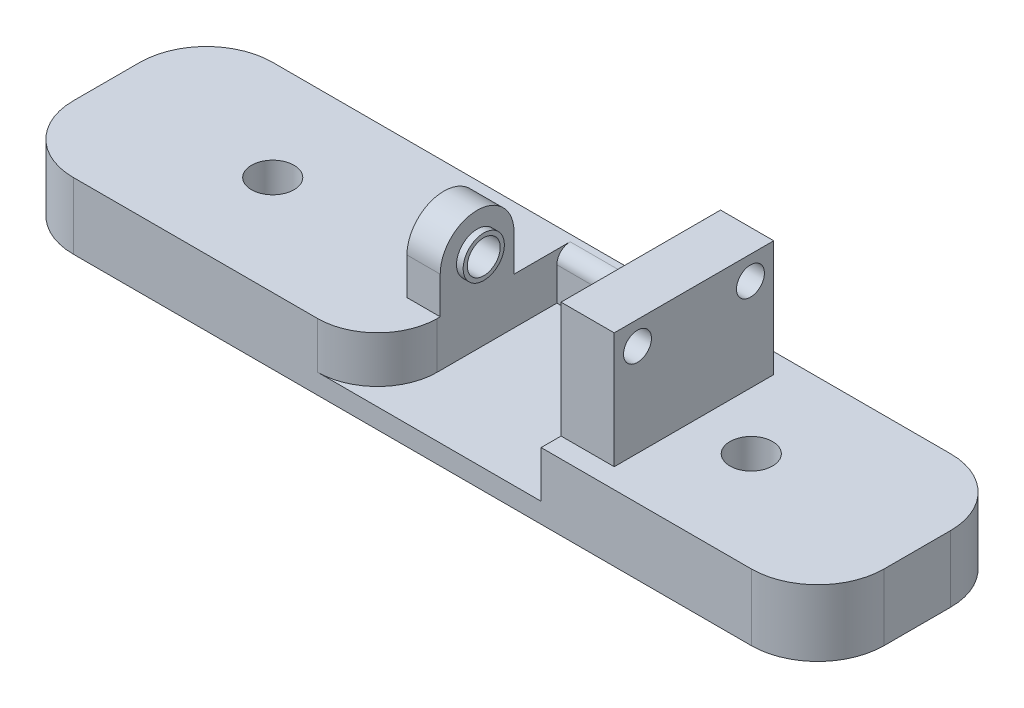
ISO-10303-21;
HEADER;
FILE_DESCRIPTION(('STEP AP214'),'2;1');
FILE_NAME('part.step','',(''),(''),'','','');
FILE_SCHEMA(('AUTOMOTIVE_DESIGN { 1 0 10303 214 1 1 1 1 }'));
ENDSEC;
DATA;
#1=APPLICATION_CONTEXT('core data for automotive mechanical design processes');
#2=APPLICATION_PROTOCOL_DEFINITION('international standard','automotive_design',2000,#1);
#3=PRODUCT_CONTEXT('',#1,'mechanical');
#4=PRODUCT('Part','Part','',(#3));
#5=PRODUCT_RELATED_PRODUCT_CATEGORY('part','',(#4));
#6=PRODUCT_DEFINITION_FORMATION('','',#4);
#7=PRODUCT_DEFINITION_CONTEXT('part definition',#1,'design');
#8=PRODUCT_DEFINITION('design','',#6,#7);
#9=PRODUCT_DEFINITION_SHAPE('','',#8);
#10=(LENGTH_UNIT() NAMED_UNIT(*) SI_UNIT(.MILLI.,.METRE.));
#11=(NAMED_UNIT(*) PLANE_ANGLE_UNIT() SI_UNIT($,.RADIAN.));
#12=(NAMED_UNIT(*) SI_UNIT($,.STERADIAN.) SOLID_ANGLE_UNIT());
#13=UNCERTAINTY_MEASURE_WITH_UNIT(LENGTH_MEASURE(1.E-05),#10,'distance_accuracy_value','');
#14=(GEOMETRIC_REPRESENTATION_CONTEXT(3) GLOBAL_UNCERTAINTY_ASSIGNED_CONTEXT((#13)) GLOBAL_UNIT_ASSIGNED_CONTEXT((#10,
#11,#12)) REPRESENTATION_CONTEXT('',''));
#15=CARTESIAN_POINT('',(0.,0.,0.));
#16=DIRECTION('',(0.,0.,1.));
#17=DIRECTION('',(1.,0.,0.));
#18=AXIS2_PLACEMENT_3D('',#15,#16,#17);
#19=CARTESIAN_POINT('',(-5.25,15.552198,0.));
#20=DIRECTION('',(1.,0.,0.));
#21=DIRECTION('',(0.,0.,-1.));
#22=AXIS2_PLACEMENT_3D('',#19,#20,#21);
#23=PLANE('',#22);
#24=DIRECTION('',(0.,0.,1.));
#25=VECTOR('',#24,1.);
#26=CARTESIAN_POINT('',(-5.25,10.,-12.));
#27=LINE('',#26,#25);
#28=CARTESIAN_POINT('',(-5.25,10.,5.552198));
#29=VERTEX_POINT('',#28);
#30=CARTESIAN_POINT('',(-5.25,10.,5.99999999999999));
#31=VERTEX_POINT('',#30);
#32=EDGE_CURVE('E388',#29,#31,#27,.T.);
#33=ORIENTED_EDGE('',*,*,#32,.T.);
#34=DIRECTION('',(0.,1.,0.));
#35=VECTOR('',#34,1.);
#36=CARTESIAN_POINT('',(-5.25,3.,5.99999999999999));
#37=LINE('',#36,#35);
#38=CARTESIAN_POINT('',(-5.25,3.,5.99999999999999));
#39=VERTEX_POINT('',#38);
#40=EDGE_CURVE('E351',#31,#39,#37,.F.);
#41=ORIENTED_EDGE('',*,*,#40,.T.);
#42=DIRECTION('',(0.,0.,1.));
#43=VECTOR('',#42,1.);
#44=CARTESIAN_POINT('',(-5.25,3.,-12.));
#45=LINE('',#44,#43);
#46=CARTESIAN_POINT('',(-5.25,3.,-12.));
#47=VERTEX_POINT('',#46);
#48=EDGE_CURVE('E214',#47,#39,#45,.T.);
#49=ORIENTED_EDGE('',*,*,#48,.F.);
#50=DIRECTION('',(0.,1.,0.));
#51=VECTOR('',#50,1.);
#52=CARTESIAN_POINT('',(-5.25,3.,-12.));
#53=LINE('',#52,#51);
#54=CARTESIAN_POINT('',(-5.25,8.,-12.));
#55=VERTEX_POINT('',#54);
#56=EDGE_CURVE('E221',#47,#55,#53,.T.);
#57=ORIENTED_EDGE('',*,*,#56,.T.);
#58=CARTESIAN_POINT('',(-5.25,8.,-14.));
#59=DIRECTION('',(1.,0.,0.));
#60=DIRECTION('',(0.,0.,-1.));
#61=AXIS2_PLACEMENT_3D('',#58,#59,#60);
#62=CIRCLE('',#61,2.);
#63=CARTESIAN_POINT('',(-5.25,10.,-14.));
#64=VERTEX_POINT('',#63);
#65=EDGE_CURVE('E53',#55,#64,#62,.F.);
#66=ORIENTED_EDGE('',*,*,#65,.T.);
#67=CARTESIAN_POINT('',(-5.25,10.,-5.552198));
#68=VERTEX_POINT('',#67);
#69=EDGE_CURVE('E60',#64,#68,#27,.T.);
#70=ORIENTED_EDGE('',*,*,#69,.T.);
#71=DIRECTION('',(0.,1.,0.));
#72=VECTOR('',#71,1.);
#73=CARTESIAN_POINT('',(-5.25,10.,-5.552198));
#74=LINE('',#73,#72);
#75=CARTESIAN_POINT('',(-5.25,15.552198,-5.552198));
#76=VERTEX_POINT('',#75);
#77=EDGE_CURVE('E234',#68,#76,#74,.T.);
#78=ORIENTED_EDGE('',*,*,#77,.T.);
#79=CARTESIAN_POINT('',(-5.25,15.552198,0.));
#80=DIRECTION('',(1.,0.,0.));
#81=DIRECTION('',(0.,0.,-1.));
#82=AXIS2_PLACEMENT_3D('',#79,#80,#81);
#83=CIRCLE('',#82,5.552198);
#84=CARTESIAN_POINT('',(-5.25,15.552198,5.552198));
#85=VERTEX_POINT('',#84);
#86=EDGE_CURVE('E229',#76,#85,#83,.T.);
#87=ORIENTED_EDGE('',*,*,#86,.T.);
#88=DIRECTION('',(0.,-1.,0.));
#89=VECTOR('',#88,1.);
#90=CARTESIAN_POINT('',(-5.25,15.552198,5.552198));
#91=LINE('',#90,#89);
#92=EDGE_CURVE('E245',#85,#29,#91,.T.);
#93=ORIENTED_EDGE('',*,*,#92,.T.);
#94=EDGE_LOOP('',(#33,#41,#49,#57,#66,#70,#78,#87,#93));
#95=FACE_BOUND('',#94,.T.);
#96=CARTESIAN_POINT('',(-5.25,15.552198,0.));
#97=DIRECTION('',(1.,0.,0.));
#98=DIRECTION('',(0.,0.,-1.));
#99=AXIS2_PLACEMENT_3D('',#96,#97,#98);
#100=CIRCLE('',#99,3.1);
#101=CARTESIAN_POINT('',(-5.25,15.552198,-3.1));
#102=VERTEX_POINT('',#101);
#103=EDGE_CURVE('E404',#102,#102,#100,.T.);
#104=ORIENTED_EDGE('',*,*,#103,.F.);
#105=EDGE_LOOP('',(#104));
#106=FACE_BOUND('',#105,.T.);
#107=ADVANCED_FACE('F45',(#95,#106),#23,.T.);
#108=CARTESIAN_POINT('',(0.,10.,0.));
#109=DIRECTION('',(0.,1.,0.));
#110=DIRECTION('',(0.,0.,1.));
#111=AXIS2_PLACEMENT_3D('',#108,#109,#110);
#112=PLANE('',#111);
#113=CARTESIAN_POINT('',(-36.,10.,0.));
#114=DIRECTION('',(0.,1.,0.));
#115=DIRECTION('',(0.,0.,1.));
#116=AXIS2_PLACEMENT_3D('',#113,#114,#115);
#117=CIRCLE('',#116,3.2);
#118=CARTESIAN_POINT('',(-36.,10.,3.2));
#119=VERTEX_POINT('',#118);
#120=EDGE_CURVE('E398',#119,#119,#117,.T.);
#121=ORIENTED_EDGE('',*,*,#120,.F.);
#122=EDGE_LOOP('',(#121));
#123=FACE_BOUND('',#122,.T.);
#124=CARTESIAN_POINT('',(36.,10.,0.));
#125=DIRECTION('',(0.,1.,0.));
#126=DIRECTION('',(0.,0.,-1.));
#127=AXIS2_PLACEMENT_3D('',#124,#125,#126);
#128=CIRCLE('',#127,3.2);
#129=CARTESIAN_POINT('',(36.,10.,-3.2));
#130=VERTEX_POINT('',#129);
#131=EDGE_CURVE('E394',#130,#130,#128,.T.);
#132=ORIENTED_EDGE('',*,*,#131,.F.);
#133=EDGE_LOOP('',(#132));
#134=FACE_BOUND('',#133,.T.);
#135=ORIENTED_EDGE('',*,*,#69,.F.);
#136=DIRECTION('',(-1.,0.,0.));
#137=VECTOR('',#136,1.);
#138=CARTESIAN_POINT('',(19.38,10.,-14.));
#139=LINE('',#138,#137);
#140=CARTESIAN_POINT('',(19.38,10.,-14.));
#141=VERTEX_POINT('',#140);
#142=EDGE_CURVE('E358',#64,#141,#139,.F.);
#143=ORIENTED_EDGE('',*,*,#142,.T.);
#144=DIRECTION('',(0.,0.,1.));
#145=VECTOR('',#144,1.);
#146=CARTESIAN_POINT('',(19.38,10.,0.));
#147=LINE('',#146,#145);
#148=CARTESIAN_POINT('',(19.38,10.,-12.));
#149=VERTEX_POINT('',#148);
#150=EDGE_CURVE('E67',#141,#149,#147,.T.);
#151=ORIENTED_EDGE('',*,*,#150,.T.);
#152=DIRECTION('',(-1.,0.,0.));
#153=VECTOR('',#152,1.);
#154=CARTESIAN_POINT('',(27.38,10.,-12.));
#155=LINE('',#154,#153);
#156=CARTESIAN_POINT('',(27.38,10.,-12.));
#157=VERTEX_POINT('',#156);
#158=EDGE_CURVE('E281',#157,#149,#155,.T.);
#159=ORIENTED_EDGE('',*,*,#158,.F.);
#160=DIRECTION('',(0.,0.,-1.));
#161=VECTOR('',#160,1.);
#162=CARTESIAN_POINT('',(27.38,10.,12.));
#163=LINE('',#162,#161);
#164=CARTESIAN_POINT('',(27.38,10.,12.));
#165=VERTEX_POINT('',#164);
#166=EDGE_CURVE('E262',#165,#157,#163,.T.);
#167=ORIENTED_EDGE('',*,*,#166,.F.);
#168=DIRECTION('',(-1.,0.,0.));
#169=VECTOR('',#168,1.);
#170=CARTESIAN_POINT('',(27.38,10.,12.));
#171=LINE('',#170,#169);
#172=CARTESIAN_POINT('',(19.38,10.,12.));
#173=VERTEX_POINT('',#172);
#174=EDGE_CURVE('E284',#165,#173,#171,.T.);
#175=ORIENTED_EDGE('',*,*,#174,.T.);
#176=DIRECTION('',(0.,0.,-1.));
#177=VECTOR('',#176,1.);
#178=CARTESIAN_POINT('',(19.38,10.,-12.));
#179=LINE('',#178,#177);
#180=CARTESIAN_POINT('',(19.38,10.,15.));
#181=VERTEX_POINT('',#180);
#182=EDGE_CURVE('E384',#181,#173,#179,.T.);
#183=ORIENTED_EDGE('',*,*,#182,.F.);
#184=DIRECTION('',(1.,0.,0.));
#185=VECTOR('',#184,1.);
#186=CARTESIAN_POINT('',(-61.,10.,15.));
#187=LINE('',#186,#185);
#188=CARTESIAN_POINT('',(51.,10.,15.));
#189=VERTEX_POINT('',#188);
#190=EDGE_CURVE('E219',#181,#189,#187,.T.);
#191=ORIENTED_EDGE('',*,*,#190,.T.);
#192=CARTESIAN_POINT('',(51.,10.,4.99999999999999));
#193=DIRECTION('',(0.,1.,0.));
#194=DIRECTION('',(0.,0.,1.));
#195=AXIS2_PLACEMENT_3D('',#192,#193,#194);
#196=CIRCLE('',#195,10.);
#197=CARTESIAN_POINT('',(61.,10.,4.99999999999999));
#198=VERTEX_POINT('',#197);
#199=EDGE_CURVE('E329',#189,#198,#196,.T.);
#200=ORIENTED_EDGE('',*,*,#199,.T.);
#201=DIRECTION('',(0.,0.,-1.));
#202=VECTOR('',#201,1.);
#203=CARTESIAN_POINT('',(61.,10.,-15.));
#204=LINE('',#203,#202);
#205=CARTESIAN_POINT('',(61.,10.,-5.00000000000001));
#206=VERTEX_POINT('',#205);
#207=EDGE_CURVE('E288',#198,#206,#204,.T.);
#208=ORIENTED_EDGE('',*,*,#207,.T.);
#209=CARTESIAN_POINT('',(51.,10.,-5.));
#210=DIRECTION('',(0.,1.,0.));
#211=DIRECTION('',(0.,0.,1.));
#212=AXIS2_PLACEMENT_3D('',#209,#210,#211);
#213=CIRCLE('',#212,10.);
#214=CARTESIAN_POINT('',(51.,10.,-15.));
#215=VERTEX_POINT('',#214);
#216=EDGE_CURVE('E331',#206,#215,#213,.T.);
#217=ORIENTED_EDGE('',*,*,#216,.T.);
#218=DIRECTION('',(-1.,0.,0.));
#219=VECTOR('',#218,1.);
#220=CARTESIAN_POINT('',(-61.,10.,-15.));
#221=LINE('',#220,#219);
#222=CARTESIAN_POINT('',(-51.,10.,-15.));
#223=VERTEX_POINT('',#222);
#224=EDGE_CURVE('E291',#215,#223,#221,.T.);
#225=ORIENTED_EDGE('',*,*,#224,.T.);
#226=CARTESIAN_POINT('',(-51.,10.,-5.));
#227=DIRECTION('',(0.,1.,0.));
#228=DIRECTION('',(0.,0.,1.));
#229=AXIS2_PLACEMENT_3D('',#226,#227,#228);
#230=CIRCLE('',#229,10.);
#231=CARTESIAN_POINT('',(-61.,10.,-5.));
#232=VERTEX_POINT('',#231);
#233=EDGE_CURVE('E335',#223,#232,#230,.T.);
#234=ORIENTED_EDGE('',*,*,#233,.T.);
#235=DIRECTION('',(0.,0.,1.));
#236=VECTOR('',#235,1.);
#237=CARTESIAN_POINT('',(-61.,10.,-15.));
#238=LINE('',#237,#236);
#239=CARTESIAN_POINT('',(-61.,10.,5.));
#240=VERTEX_POINT('',#239);
#241=EDGE_CURVE('E295',#232,#240,#238,.T.);
#242=ORIENTED_EDGE('',*,*,#241,.T.);
#243=CARTESIAN_POINT('',(-51.,10.,5.));
#244=DIRECTION('',(0.,1.,0.));
#245=DIRECTION('',(0.,0.,1.));
#246=AXIS2_PLACEMENT_3D('',#243,#244,#245);
#247=CIRCLE('',#246,10.);
#248=CARTESIAN_POINT('',(-51.,10.,15.));
#249=VERTEX_POINT('',#248);
#250=EDGE_CURVE('E333',#240,#249,#247,.T.);
#251=ORIENTED_EDGE('',*,*,#250,.T.);
#252=CARTESIAN_POINT('',(-14.25,10.,15.));
#253=VERTEX_POINT('',#252);
#254=EDGE_CURVE('E298',#249,#253,#187,.T.);
#255=ORIENTED_EDGE('',*,*,#254,.T.);
#256=CARTESIAN_POINT('',(-14.25,10.,6.));
#257=DIRECTION('',(0.,1.,0.));
#258=DIRECTION('',(0.,0.,1.));
#259=AXIS2_PLACEMENT_3D('',#256,#257,#258);
#260=CIRCLE('',#259,9.);
#261=EDGE_CURVE('E349',#253,#31,#260,.T.);
#262=ORIENTED_EDGE('',*,*,#261,.T.);
#263=ORIENTED_EDGE('',*,*,#32,.F.);
#264=DIRECTION('',(1.,0.,0.));
#265=VECTOR('',#264,1.);
#266=CARTESIAN_POINT('',(-10.25,10.,5.552198));
#267=LINE('',#266,#265);
#268=CARTESIAN_POINT('',(-10.25,10.,5.552198));
#269=VERTEX_POINT('',#268);
#270=EDGE_CURVE('E255',#269,#29,#267,.T.);
#271=ORIENTED_EDGE('',*,*,#270,.F.);
#272=DIRECTION('',(0.,0.,-1.));
#273=VECTOR('',#272,1.);
#274=CARTESIAN_POINT('',(-10.25,10.,5.552198));
#275=LINE('',#274,#273);
#276=CARTESIAN_POINT('',(-10.25,10.,-5.552198));
#277=VERTEX_POINT('',#276);
#278=EDGE_CURVE('E237',#269,#277,#275,.T.);
#279=ORIENTED_EDGE('',*,*,#278,.T.);
#280=DIRECTION('',(1.,0.,0.));
#281=VECTOR('',#280,1.);
#282=CARTESIAN_POINT('',(-10.25,10.,-5.552198));
#283=LINE('',#282,#281);
#284=EDGE_CURVE('E253',#277,#68,#283,.T.);
#285=ORIENTED_EDGE('',*,*,#284,.T.);
#286=EDGE_LOOP('',(#135,#143,#151,#159,#167,#175,#183,#191,#200,#208,#217,#225,#234,#242,#251,
#255,#262,#263,#271,#279,#285));
#287=FACE_BOUND('',#286,.T.);
#288=ADVANCED_FACE('F368',(#123,#134,#287),#112,.T.);
#289=CARTESIAN_POINT('',(61.,10.,-15.));
#290=DIRECTION('',(-1.,0.,0.));
#291=DIRECTION('',(0.,0.,1.));
#292=AXIS2_PLACEMENT_3D('',#289,#290,#291);
#293=PLANE('',#292);
#294=DIRECTION('',(0.,0.,-1.));
#295=VECTOR('',#294,1.);
#296=CARTESIAN_POINT('',(61.,0.,-15.));
#297=LINE('',#296,#295);
#298=CARTESIAN_POINT('',(61.,0.,4.99999999999999));
#299=VERTEX_POINT('',#298);
#300=CARTESIAN_POINT('',(61.,0.,-5.00000000000001));
#301=VERTEX_POINT('',#300);
#302=EDGE_CURVE('E287',#299,#301,#297,.T.);
#303=ORIENTED_EDGE('',*,*,#302,.T.);
#304=DIRECTION('',(0.,-1.,0.));
#305=VECTOR('',#304,1.);
#306=CARTESIAN_POINT('',(61.,10.,-5.00000000000001));
#307=LINE('',#306,#305);
#308=EDGE_CURVE('E345',#301,#206,#307,.F.);
#309=ORIENTED_EDGE('',*,*,#308,.T.);
#310=ORIENTED_EDGE('',*,*,#207,.F.);
#311=DIRECTION('',(0.,-1.,0.));
#312=VECTOR('',#311,1.);
#313=CARTESIAN_POINT('',(61.,10.,4.99999999999999));
#314=LINE('',#313,#312);
#315=EDGE_CURVE('E342',#198,#299,#314,.T.);
#316=ORIENTED_EDGE('',*,*,#315,.T.);
#317=EDGE_LOOP('',(#303,#309,#310,#316));
#318=FACE_BOUND('',#317,.T.);
#319=ADVANCED_FACE('F467',(#318),#293,.F.);
#320=CARTESIAN_POINT('',(-61.,10.,-15.));
#321=DIRECTION('',(0.,0.,1.));
#322=DIRECTION('',(1.,0.,0.));
#323=AXIS2_PLACEMENT_3D('',#320,#321,#322);
#324=PLANE('',#323);
#325=DIRECTION('',(-1.,0.,0.));
#326=VECTOR('',#325,1.);
#327=CARTESIAN_POINT('',(-61.,0.,-15.));
#328=LINE('',#327,#326);
#329=CARTESIAN_POINT('',(51.,0.,-15.));
#330=VERTEX_POINT('',#329);
#331=CARTESIAN_POINT('',(-51.,0.,-15.));
#332=VERTEX_POINT('',#331);
#333=EDGE_CURVE('E304',#330,#332,#328,.T.);
#334=ORIENTED_EDGE('',*,*,#333,.T.);
#335=DIRECTION('',(0.,-1.,0.));
#336=VECTOR('',#335,1.);
#337=CARTESIAN_POINT('',(-51.,10.,-15.));
#338=LINE('',#337,#336);
#339=EDGE_CURVE('E327',#332,#223,#338,.F.);
#340=ORIENTED_EDGE('',*,*,#339,.T.);
#341=ORIENTED_EDGE('',*,*,#224,.F.);
#342=DIRECTION('',(0.,-1.,0.));
#343=VECTOR('',#342,1.);
#344=CARTESIAN_POINT('',(51.,10.,-15.));
#345=LINE('',#344,#343);
#346=EDGE_CURVE('E324',#215,#330,#345,.T.);
#347=ORIENTED_EDGE('',*,*,#346,.T.);
#348=EDGE_LOOP('',(#334,#340,#341,#347));
#349=FACE_BOUND('',#348,.T.);
#350=ADVANCED_FACE('F503',(#349),#324,.F.);
#351=CARTESIAN_POINT('',(-61.,10.,-15.));
#352=DIRECTION('',(1.,0.,0.));
#353=DIRECTION('',(0.,0.,-1.));
#354=AXIS2_PLACEMENT_3D('',#351,#352,#353);
#355=PLANE('',#354);
#356=ORIENTED_EDGE('',*,*,#241,.F.);
#357=DIRECTION('',(0.,-1.,0.));
#358=VECTOR('',#357,1.);
#359=CARTESIAN_POINT('',(-61.,10.,-5.));
#360=LINE('',#359,#358);
#361=CARTESIAN_POINT('',(-61.,0.,-5.));
#362=VERTEX_POINT('',#361);
#363=EDGE_CURVE('E313',#232,#362,#360,.T.);
#364=ORIENTED_EDGE('',*,*,#363,.T.);
#365=DIRECTION('',(0.,0.,1.));
#366=VECTOR('',#365,1.);
#367=CARTESIAN_POINT('',(-61.,0.,-15.));
#368=LINE('',#367,#366);
#369=CARTESIAN_POINT('',(-61.,0.,5.));
#370=VERTEX_POINT('',#369);
#371=EDGE_CURVE('E307',#362,#370,#368,.T.);
#372=ORIENTED_EDGE('',*,*,#371,.T.);
#373=DIRECTION('',(0.,-1.,0.));
#374=VECTOR('',#373,1.);
#375=CARTESIAN_POINT('',(-61.,10.,5.));
#376=LINE('',#375,#374);
#377=EDGE_CURVE('E301',#370,#240,#376,.F.);
#378=ORIENTED_EDGE('',*,*,#377,.T.);
#379=EDGE_LOOP('',(#356,#364,#372,#378));
#380=FACE_BOUND('',#379,.T.);
#381=ADVANCED_FACE('F500',(#380),#355,.F.);
#382=CARTESIAN_POINT('',(-61.,10.,15.));
#383=DIRECTION('',(0.,0.,-1.));
#384=DIRECTION('',(-1.,0.,0.));
#385=AXIS2_PLACEMENT_3D('',#382,#383,#384);
#386=PLANE('',#385);
#387=DIRECTION('',(1.,0.,0.));
#388=VECTOR('',#387,1.);
#389=CARTESIAN_POINT('',(-5.25,3.,15.));
#390=LINE('',#389,#388);
#391=CARTESIAN_POINT('',(-14.25,3.,15.));
#392=VERTEX_POINT('',#391);
#393=CARTESIAN_POINT('',(19.38,3.,15.));
#394=VERTEX_POINT('',#393);
#395=EDGE_CURVE('E204',#392,#394,#390,.T.);
#396=ORIENTED_EDGE('',*,*,#395,.F.);
#397=DIRECTION('',(0.,1.,0.));
#398=VECTOR('',#397,1.);
#399=CARTESIAN_POINT('',(-14.25,10.,15.));
#400=LINE('',#399,#398);
#401=EDGE_CURVE('E347',#392,#253,#400,.T.);
#402=ORIENTED_EDGE('',*,*,#401,.T.);
#403=ORIENTED_EDGE('',*,*,#254,.F.);
#404=DIRECTION('',(0.,-1.,0.));
#405=VECTOR('',#404,1.);
#406=CARTESIAN_POINT('',(-51.,10.,15.));
#407=LINE('',#406,#405);
#408=CARTESIAN_POINT('',(-51.,0.,15.));
#409=VERTEX_POINT('',#408);
#410=EDGE_CURVE('E339',#249,#409,#407,.T.);
#411=ORIENTED_EDGE('',*,*,#410,.T.);
#412=DIRECTION('',(1.,0.,0.));
#413=VECTOR('',#412,1.);
#414=CARTESIAN_POINT('',(-61.,0.,15.));
#415=LINE('',#414,#413);
#416=CARTESIAN_POINT('',(51.,0.,15.));
#417=VERTEX_POINT('',#416);
#418=EDGE_CURVE('E292',#409,#417,#415,.T.);
#419=ORIENTED_EDGE('',*,*,#418,.T.);
#420=DIRECTION('',(0.,-1.,0.));
#421=VECTOR('',#420,1.);
#422=CARTESIAN_POINT('',(51.,10.,15.));
#423=LINE('',#422,#421);
#424=EDGE_CURVE('E337',#417,#189,#423,.F.);
#425=ORIENTED_EDGE('',*,*,#424,.T.);
#426=ORIENTED_EDGE('',*,*,#190,.F.);
#427=DIRECTION('',(0.,1.,0.));
#428=VECTOR('',#427,1.);
#429=CARTESIAN_POINT('',(19.38,3.,15.));
#430=LINE('',#429,#428);
#431=EDGE_CURVE('E196',#394,#181,#430,.T.);
#432=ORIENTED_EDGE('',*,*,#431,.F.);
#433=EDGE_LOOP('',(#396,#402,#403,#411,#419,#425,#426,#432));
#434=FACE_BOUND('',#433,.T.);
#435=ADVANCED_FACE('F217',(#434),#386,.F.);
#436=CARTESIAN_POINT('',(0.,0.,0.));
#437=DIRECTION('',(0.,1.,0.));
#438=DIRECTION('',(0.,0.,1.));
#439=AXIS2_PLACEMENT_3D('',#436,#437,#438);
#440=PLANE('',#439);
#441=CARTESIAN_POINT('',(-36.,0.,0.));
#442=DIRECTION('',(0.,1.,0.));
#443=DIRECTION('',(0.,0.,1.));
#444=AXIS2_PLACEMENT_3D('',#441,#442,#443);
#445=CIRCLE('',#444,3.2);
#446=CARTESIAN_POINT('',(-36.,0.,3.2));
#447=VERTEX_POINT('',#446);
#448=EDGE_CURVE('E401',#447,#447,#445,.T.);
#449=ORIENTED_EDGE('',*,*,#448,.T.);
#450=EDGE_LOOP('',(#449));
#451=FACE_BOUND('',#450,.T.);
#452=CARTESIAN_POINT('',(36.,0.,0.));
#453=DIRECTION('',(0.,1.,0.));
#454=DIRECTION('',(0.,0.,-1.));
#455=AXIS2_PLACEMENT_3D('',#452,#453,#454);
#456=CIRCLE('',#455,3.2);
#457=CARTESIAN_POINT('',(36.,0.,-3.2));
#458=VERTEX_POINT('',#457);
#459=EDGE_CURVE('E391',#458,#458,#456,.T.);
#460=ORIENTED_EDGE('',*,*,#459,.T.);
#461=EDGE_LOOP('',(#460));
#462=FACE_BOUND('',#461,.T.);
#463=ORIENTED_EDGE('',*,*,#371,.F.);
#464=CARTESIAN_POINT('',(-51.,0.,-5.));
#465=DIRECTION('',(0.,1.,0.));
#466=DIRECTION('',(0.,0.,1.));
#467=AXIS2_PLACEMENT_3D('',#464,#465,#466);
#468=CIRCLE('',#467,10.);
#469=EDGE_CURVE('E322',#362,#332,#468,.F.);
#470=ORIENTED_EDGE('',*,*,#469,.T.);
#471=ORIENTED_EDGE('',*,*,#333,.F.);
#472=CARTESIAN_POINT('',(51.,0.,-5.));
#473=DIRECTION('',(0.,1.,0.));
#474=DIRECTION('',(0.,0.,1.));
#475=AXIS2_PLACEMENT_3D('',#472,#473,#474);
#476=CIRCLE('',#475,10.);
#477=EDGE_CURVE('E318',#330,#301,#476,.F.);
#478=ORIENTED_EDGE('',*,*,#477,.T.);
#479=ORIENTED_EDGE('',*,*,#302,.F.);
#480=CARTESIAN_POINT('',(51.,0.,4.99999999999999));
#481=DIRECTION('',(0.,1.,0.));
#482=DIRECTION('',(0.,0.,1.));
#483=AXIS2_PLACEMENT_3D('',#480,#481,#482);
#484=CIRCLE('',#483,10.);
#485=EDGE_CURVE('E316',#299,#417,#484,.F.);
#486=ORIENTED_EDGE('',*,*,#485,.T.);
#487=ORIENTED_EDGE('',*,*,#418,.F.);
#488=CARTESIAN_POINT('',(-51.,0.,5.));
#489=DIRECTION('',(0.,1.,0.));
#490=DIRECTION('',(0.,0.,1.));
#491=AXIS2_PLACEMENT_3D('',#488,#489,#490);
#492=CIRCLE('',#491,10.);
#493=EDGE_CURVE('E320',#409,#370,#492,.F.);
#494=ORIENTED_EDGE('',*,*,#493,.T.);
#495=EDGE_LOOP('',(#463,#470,#471,#478,#479,#486,#487,#494));
#496=FACE_BOUND('',#495,.T.);
#497=ADVANCED_FACE('F493',(#451,#462,#496),#440,.F.);
#498=CARTESIAN_POINT('',(27.38,10.,12.));
#499=DIRECTION('',(0.,0.,-1.));
#500=DIRECTION('',(-1.,0.,0.));
#501=AXIS2_PLACEMENT_3D('',#498,#499,#500);
#502=PLANE('',#501);
#503=DIRECTION('',(0.,-1.,0.));
#504=VECTOR('',#503,1.);
#505=CARTESIAN_POINT('',(19.38,10.,12.));
#506=LINE('',#505,#504);
#507=CARTESIAN_POINT('',(19.38,27.447802,12.));
#508=VERTEX_POINT('',#507);
#509=EDGE_CURVE('E252',#508,#173,#506,.T.);
#510=ORIENTED_EDGE('',*,*,#509,.T.);
#511=ORIENTED_EDGE('',*,*,#174,.F.);
#512=DIRECTION('',(0.,-1.,0.));
#513=VECTOR('',#512,1.);
#514=CARTESIAN_POINT('',(27.38,10.,12.));
#515=LINE('',#514,#513);
#516=CARTESIAN_POINT('',(27.38,27.447802,12.));
#517=VERTEX_POINT('',#516);
#518=EDGE_CURVE('E259',#517,#165,#515,.T.);
#519=ORIENTED_EDGE('',*,*,#518,.F.);
#520=DIRECTION('',(-1.,0.,0.));
#521=VECTOR('',#520,1.);
#522=CARTESIAN_POINT('',(27.38,27.447802,12.));
#523=LINE('',#522,#521);
#524=EDGE_CURVE('E270',#517,#508,#523,.T.);
#525=ORIENTED_EDGE('',*,*,#524,.T.);
#526=EDGE_LOOP('',(#510,#511,#519,#525));
#527=FACE_BOUND('',#526,.T.);
#528=ADVANCED_FACE('F380',(#527),#502,.F.);
#529=CARTESIAN_POINT('',(27.38,10.,-12.));
#530=DIRECTION('',(0.,0.,1.));
#531=DIRECTION('',(1.,0.,0.));
#532=AXIS2_PLACEMENT_3D('',#529,#530,#531);
#533=PLANE('',#532);
#534=DIRECTION('',(0.,1.,0.));
#535=VECTOR('',#534,1.);
#536=CARTESIAN_POINT('',(19.38,10.,-12.));
#537=LINE('',#536,#535);
#538=CARTESIAN_POINT('',(19.38,27.447802,-12.));
#539=VERTEX_POINT('',#538);
#540=EDGE_CURVE('E273',#149,#539,#537,.T.);
#541=ORIENTED_EDGE('',*,*,#540,.T.);
#542=DIRECTION('',(-1.,0.,0.));
#543=VECTOR('',#542,1.);
#544=CARTESIAN_POINT('',(27.38,27.447802,-12.));
#545=LINE('',#544,#543);
#546=CARTESIAN_POINT('',(27.38,27.447802,-12.));
#547=VERTEX_POINT('',#546);
#548=EDGE_CURVE('E278',#547,#539,#545,.T.);
#549=ORIENTED_EDGE('',*,*,#548,.F.);
#550=DIRECTION('',(0.,1.,0.));
#551=VECTOR('',#550,1.);
#552=CARTESIAN_POINT('',(27.38,10.,-12.));
#553=LINE('',#552,#551);
#554=EDGE_CURVE('E266',#157,#547,#553,.T.);
#555=ORIENTED_EDGE('',*,*,#554,.F.);
#556=ORIENTED_EDGE('',*,*,#158,.T.);
#557=EDGE_LOOP('',(#541,#549,#555,#556));
#558=FACE_BOUND('',#557,.T.);
#559=ADVANCED_FACE('F371',(#558),#533,.F.);
#560=CARTESIAN_POINT('',(27.38,27.447802,12.));
#561=DIRECTION('',(0.,-1.,0.));
#562=DIRECTION('',(0.,0.,-1.));
#563=AXIS2_PLACEMENT_3D('',#560,#561,#562);
#564=PLANE('',#563);
#565=DIRECTION('',(0.,0.,1.));
#566=VECTOR('',#565,1.);
#567=CARTESIAN_POINT('',(19.38,27.447802,12.));
#568=LINE('',#567,#566);
#569=EDGE_CURVE('E263',#539,#508,#568,.T.);
#570=ORIENTED_EDGE('',*,*,#569,.T.);
#571=ORIENTED_EDGE('',*,*,#524,.F.);
#572=DIRECTION('',(0.,0.,1.));
#573=VECTOR('',#572,1.);
#574=CARTESIAN_POINT('',(27.38,27.447802,12.));
#575=LINE('',#574,#573);
#576=EDGE_CURVE('E268',#547,#517,#575,.T.);
#577=ORIENTED_EDGE('',*,*,#576,.F.);
#578=ORIENTED_EDGE('',*,*,#548,.T.);
#579=EDGE_LOOP('',(#570,#571,#577,#578));
#580=FACE_BOUND('',#579,.T.);
#581=ADVANCED_FACE('F376',(#580),#564,.F.);
#582=CARTESIAN_POINT('',(27.38,0.,0.));
#583=DIRECTION('',(-1.,0.,0.));
#584=DIRECTION('',(0.,0.,1.));
#585=AXIS2_PLACEMENT_3D('',#582,#583,#584);
#586=PLANE('',#585);
#587=CARTESIAN_POINT('',(27.38,23.947802,-8.50000000000001));
#588=DIRECTION('',(-1.,0.,0.));
#589=DIRECTION('',(0.,0.,1.));
#590=AXIS2_PLACEMENT_3D('',#587,#588,#589);
#591=CIRCLE('',#590,2.1);
#592=CARTESIAN_POINT('',(27.38,23.947802,-6.40000000000001));
#593=VERTEX_POINT('',#592);
#594=EDGE_CURVE('E419',#593,#593,#591,.T.);
#595=ORIENTED_EDGE('',*,*,#594,.T.);
#596=EDGE_LOOP('',(#595));
#597=FACE_BOUND('',#596,.T.);
#598=CARTESIAN_POINT('',(27.38,23.947802,8.49999999999999));
#599=DIRECTION('',(-1.,0.,0.));
#600=DIRECTION('',(0.,0.,1.));
#601=AXIS2_PLACEMENT_3D('',#598,#599,#600);
#602=CIRCLE('',#601,2.1);
#603=CARTESIAN_POINT('',(27.38,23.947802,10.6));
#604=VERTEX_POINT('',#603);
#605=EDGE_CURVE('E412',#604,#604,#602,.T.);
#606=ORIENTED_EDGE('',*,*,#605,.T.);
#607=EDGE_LOOP('',(#606));
#608=FACE_BOUND('',#607,.T.);
#609=ORIENTED_EDGE('',*,*,#518,.T.);
#610=ORIENTED_EDGE('',*,*,#166,.T.);
#611=ORIENTED_EDGE('',*,*,#554,.T.);
#612=ORIENTED_EDGE('',*,*,#576,.T.);
#613=EDGE_LOOP('',(#609,#610,#611,#612));
#614=FACE_BOUND('',#613,.T.);
#615=ADVANCED_FACE('F383',(#597,#608,#614),#586,.F.);
#616=CARTESIAN_POINT('',(19.38,0.,0.));
#617=DIRECTION('',(-1.,0.,0.));
#618=DIRECTION('',(0.,0.,1.));
#619=AXIS2_PLACEMENT_3D('',#616,#617,#618);
#620=PLANE('',#619);
#621=CARTESIAN_POINT('',(19.38,23.947802,-8.5));
#622=DIRECTION('',(-1.,0.,0.));
#623=DIRECTION('',(0.,0.,1.));
#624=AXIS2_PLACEMENT_3D('',#621,#622,#623);
#625=CIRCLE('',#624,2.1);
#626=CARTESIAN_POINT('',(19.38,23.947802,-6.40000000000001));
#627=VERTEX_POINT('',#626);
#628=EDGE_CURVE('E422',#627,#627,#625,.T.);
#629=ORIENTED_EDGE('',*,*,#628,.F.);
#630=EDGE_LOOP('',(#629));
#631=FACE_BOUND('',#630,.T.);
#632=CARTESIAN_POINT('',(19.38,6.947802,-8.5));
#633=DIRECTION('',(-1.,0.,0.));
#634=DIRECTION('',(0.,0.,1.));
#635=AXIS2_PLACEMENT_3D('',#632,#633,#634);
#636=CIRCLE('',#635,2.1);
#637=CARTESIAN_POINT('',(19.38,6.947802,-6.4));
#638=VERTEX_POINT('',#637);
#639=EDGE_CURVE('E428',#638,#638,#636,.T.);
#640=ORIENTED_EDGE('',*,*,#639,.F.);
#641=EDGE_LOOP('',(#640));
#642=FACE_BOUND('',#641,.T.);
#643=CARTESIAN_POINT('',(19.38,6.947802,8.49999999999999));
#644=DIRECTION('',(-1.,0.,0.));
#645=DIRECTION('',(0.,0.,1.));
#646=AXIS2_PLACEMENT_3D('',#643,#644,#645);
#647=CIRCLE('',#646,2.1);
#648=CARTESIAN_POINT('',(19.38,6.947802,10.6));
#649=VERTEX_POINT('',#648);
#650=EDGE_CURVE('E416',#649,#649,#647,.T.);
#651=ORIENTED_EDGE('',*,*,#650,.F.);
#652=EDGE_LOOP('',(#651));
#653=FACE_BOUND('',#652,.T.);
#654=CARTESIAN_POINT('',(19.38,23.947802,8.49999999999999));
#655=DIRECTION('',(-1.,0.,0.));
#656=DIRECTION('',(0.,0.,1.));
#657=AXIS2_PLACEMENT_3D('',#654,#655,#656);
#658=CIRCLE('',#657,2.1);
#659=CARTESIAN_POINT('',(19.38,23.947802,10.6));
#660=VERTEX_POINT('',#659);
#661=EDGE_CURVE('E413',#660,#660,#658,.T.);
#662=ORIENTED_EDGE('',*,*,#661,.F.);
#663=EDGE_LOOP('',(#662));
#664=FACE_BOUND('',#663,.T.);
#665=ORIENTED_EDGE('',*,*,#509,.F.);
#666=ORIENTED_EDGE('',*,*,#569,.F.);
#667=ORIENTED_EDGE('',*,*,#540,.F.);
#668=ORIENTED_EDGE('',*,*,#150,.F.);
#669=CARTESIAN_POINT('',(19.38,8.,-14.));
#670=DIRECTION('',(-1.,0.,0.));
#671=DIRECTION('',(0.,0.,1.));
#672=AXIS2_PLACEMENT_3D('',#669,#670,#671);
#673=CIRCLE('',#672,2.);
#674=CARTESIAN_POINT('',(19.38,8.,-12.));
#675=VERTEX_POINT('',#674);
#676=EDGE_CURVE('E11',#141,#675,#673,.F.);
#677=ORIENTED_EDGE('',*,*,#676,.T.);
#678=DIRECTION('',(0.,1.,0.));
#679=VECTOR('',#678,1.);
#680=CARTESIAN_POINT('',(19.38,3.,-12.));
#681=LINE('',#680,#679);
#682=CARTESIAN_POINT('',(19.38,3.,-12.));
#683=VERTEX_POINT('',#682);
#684=EDGE_CURVE('E199',#683,#675,#681,.T.);
#685=ORIENTED_EDGE('',*,*,#684,.F.);
#686=DIRECTION('',(0.,0.,-1.));
#687=VECTOR('',#686,1.);
#688=CARTESIAN_POINT('',(19.38,3.,-12.));
#689=LINE('',#688,#687);
#690=EDGE_CURVE('E191',#394,#683,#689,.T.);
#691=ORIENTED_EDGE('',*,*,#690,.F.);
#692=ORIENTED_EDGE('',*,*,#431,.T.);
#693=ORIENTED_EDGE('',*,*,#182,.T.);
#694=EDGE_LOOP('',(#665,#666,#667,#668,#677,#685,#691,#692,#693));
#695=FACE_BOUND('',#694,.T.);
#696=ADVANCED_FACE('F194',(#631,#642,#653,#664,#695),#620,.T.);
#697=CARTESIAN_POINT('',(-10.25,15.552198,0.));
#698=DIRECTION('',(1.,0.,0.));
#699=DIRECTION('',(0.,0.,-1.));
#700=AXIS2_PLACEMENT_3D('',#697,#698,#699);
#701=CYLINDRICAL_SURFACE('',#700,5.552198);
#702=ORIENTED_EDGE('',*,*,#86,.F.);
#703=DIRECTION('',(1.,0.,0.));
#704=VECTOR('',#703,1.);
#705=CARTESIAN_POINT('',(-10.25,15.552198,-5.552198));
#706=LINE('',#705,#704);
#707=CARTESIAN_POINT('',(-10.25,15.552198,-5.552198));
#708=VERTEX_POINT('',#707);
#709=EDGE_CURVE('E250',#708,#76,#706,.T.);
#710=ORIENTED_EDGE('',*,*,#709,.F.);
#711=CARTESIAN_POINT('',(-10.25,15.552198,0.));
#712=DIRECTION('',(1.,0.,0.));
#713=DIRECTION('',(0.,0.,-1.));
#714=AXIS2_PLACEMENT_3D('',#711,#712,#713);
#715=CIRCLE('',#714,5.552198);
#716=CARTESIAN_POINT('',(-10.25,15.552198,5.552198));
#717=VERTEX_POINT('',#716);
#718=EDGE_CURVE('E230',#708,#717,#715,.T.);
#719=ORIENTED_EDGE('',*,*,#718,.T.);
#720=DIRECTION('',(1.,0.,0.));
#721=VECTOR('',#720,1.);
#722=CARTESIAN_POINT('',(-10.25,15.552198,5.552198));
#723=LINE('',#722,#721);
#724=EDGE_CURVE('E242',#717,#85,#723,.T.);
#725=ORIENTED_EDGE('',*,*,#724,.T.);
#726=EDGE_LOOP('',(#702,#710,#719,#725));
#727=FACE_BOUND('',#726,.T.);
#728=ADVANCED_FACE('F441',(#727),#701,.T.);
#729=CARTESIAN_POINT('',(-10.25,10.,-5.552198));
#730=DIRECTION('',(0.,0.,-1.));
#731=DIRECTION('',(-1.,0.,0.));
#732=AXIS2_PLACEMENT_3D('',#729,#730,#731);
#733=PLANE('',#732);
#734=ORIENTED_EDGE('',*,*,#77,.F.);
#735=ORIENTED_EDGE('',*,*,#284,.F.);
#736=DIRECTION('',(0.,1.,0.));
#737=VECTOR('',#736,1.);
#738=CARTESIAN_POINT('',(-10.25,10.,-5.552198));
#739=LINE('',#738,#737);
#740=EDGE_CURVE('E239',#277,#708,#739,.T.);
#741=ORIENTED_EDGE('',*,*,#740,.T.);
#742=ORIENTED_EDGE('',*,*,#709,.T.);
#743=EDGE_LOOP('',(#734,#735,#741,#742));
#744=FACE_BOUND('',#743,.T.);
#745=ADVANCED_FACE('F474',(#744),#733,.T.);
#746=CARTESIAN_POINT('',(-10.25,15.552198,5.552198));
#747=DIRECTION('',(0.,0.,1.));
#748=DIRECTION('',(1.,0.,0.));
#749=AXIS2_PLACEMENT_3D('',#746,#747,#748);
#750=PLANE('',#749);
#751=ORIENTED_EDGE('',*,*,#92,.F.);
#752=ORIENTED_EDGE('',*,*,#724,.F.);
#753=DIRECTION('',(0.,-1.,0.));
#754=VECTOR('',#753,1.);
#755=CARTESIAN_POINT('',(-10.25,15.552198,5.552198));
#756=LINE('',#755,#754);
#757=EDGE_CURVE('E233',#717,#269,#756,.T.);
#758=ORIENTED_EDGE('',*,*,#757,.T.);
#759=ORIENTED_EDGE('',*,*,#270,.T.);
#760=EDGE_LOOP('',(#751,#752,#758,#759));
#761=FACE_BOUND('',#760,.T.);
#762=ADVANCED_FACE('F477',(#761),#750,.T.);
#763=CARTESIAN_POINT('',(-10.25,15.552198,0.));
#764=DIRECTION('',(1.,0.,0.));
#765=DIRECTION('',(0.,0.,-1.));
#766=AXIS2_PLACEMENT_3D('',#763,#764,#765);
#767=PLANE('',#766);
#768=CARTESIAN_POINT('',(-10.25,15.552198,0.));
#769=DIRECTION('',(1.,0.,0.));
#770=DIRECTION('',(0.,0.,-1.));
#771=AXIS2_PLACEMENT_3D('',#768,#769,#770);
#772=CIRCLE('',#771,2.475);
#773=CARTESIAN_POINT('',(-10.25,15.552198,-2.475));
#774=VERTEX_POINT('',#773);
#775=EDGE_CURVE('E226',#774,#774,#772,.T.);
#776=ORIENTED_EDGE('',*,*,#775,.T.);
#777=EDGE_LOOP('',(#776));
#778=FACE_BOUND('',#777,.T.);
#779=ORIENTED_EDGE('',*,*,#718,.F.);
#780=ORIENTED_EDGE('',*,*,#740,.F.);
#781=ORIENTED_EDGE('',*,*,#278,.F.);
#782=ORIENTED_EDGE('',*,*,#757,.F.);
#783=EDGE_LOOP('',(#779,#780,#781,#782));
#784=FACE_BOUND('',#783,.T.);
#785=ADVANCED_FACE('F472',(#778,#784),#767,.F.);
#786=CARTESIAN_POINT('',(-10.25,15.552198,0.));
#787=DIRECTION('',(1.,0.,0.));
#788=DIRECTION('',(0.,0.,-1.));
#789=AXIS2_PLACEMENT_3D('',#786,#787,#788);
#790=CYLINDRICAL_SURFACE('',#789,2.475);
#791=ORIENTED_EDGE('',*,*,#775,.F.);
#792=EDGE_LOOP('',(#791));
#793=FACE_BOUND('',#792,.T.);
#794=CARTESIAN_POINT('',(-4.25,15.552198,0.));
#795=DIRECTION('',(1.,0.,0.));
#796=DIRECTION('',(0.,0.,-1.));
#797=AXIS2_PLACEMENT_3D('',#794,#795,#796);
#798=CIRCLE('',#797,2.475);
#799=CARTESIAN_POINT('',(-4.25,15.552198,-2.475));
#800=VERTEX_POINT('',#799);
#801=EDGE_CURVE('E407',#800,#800,#798,.T.);
#802=ORIENTED_EDGE('',*,*,#801,.T.);
#803=EDGE_LOOP('',(#802));
#804=FACE_BOUND('',#803,.T.);
#805=ADVANCED_FACE('F567',(#793,#804),#790,.F.);
#806=CARTESIAN_POINT('',(-5.25,3.,-12.));
#807=DIRECTION('',(0.,0.,-1.));
#808=DIRECTION('',(-1.,0.,0.));
#809=AXIS2_PLACEMENT_3D('',#806,#807,#808);
#810=PLANE('',#809);
#811=ORIENTED_EDGE('',*,*,#684,.T.);
#812=DIRECTION('',(-1.,0.,0.));
#813=VECTOR('',#812,1.);
#814=CARTESIAN_POINT('',(-5.25,8.,-12.));
#815=LINE('',#814,#813);
#816=EDGE_CURVE('E354',#675,#55,#815,.T.);
#817=ORIENTED_EDGE('',*,*,#816,.T.);
#818=ORIENTED_EDGE('',*,*,#56,.F.);
#819=DIRECTION('',(-1.,0.,0.));
#820=VECTOR('',#819,1.);
#821=CARTESIAN_POINT('',(-5.25,3.,-12.));
#822=LINE('',#821,#820);
#823=EDGE_CURVE('E203',#683,#47,#822,.T.);
#824=ORIENTED_EDGE('',*,*,#823,.F.);
#825=EDGE_LOOP('',(#811,#817,#818,#824));
#826=FACE_BOUND('',#825,.T.);
#827=ADVANCED_FACE('F572',(#826),#810,.F.);
#828=CARTESIAN_POINT('',(0.,3.,0.));
#829=DIRECTION('',(0.,1.,0.));
#830=DIRECTION('',(0.,0.,1.));
#831=AXIS2_PLACEMENT_3D('',#828,#829,#830);
#832=PLANE('',#831);
#833=ORIENTED_EDGE('',*,*,#48,.T.);
#834=CARTESIAN_POINT('',(-14.25,3.,6.));
#835=DIRECTION('',(0.,1.,0.));
#836=DIRECTION('',(0.,0.,1.));
#837=AXIS2_PLACEMENT_3D('',#834,#835,#836);
#838=CIRCLE('',#837,9.);
#839=EDGE_CURVE('E210',#39,#392,#838,.F.);
#840=ORIENTED_EDGE('',*,*,#839,.T.);
#841=ORIENTED_EDGE('',*,*,#395,.T.);
#842=ORIENTED_EDGE('',*,*,#690,.T.);
#843=ORIENTED_EDGE('',*,*,#823,.T.);
#844=EDGE_LOOP('',(#833,#840,#841,#842,#843));
#845=FACE_BOUND('',#844,.T.);
#846=ADVANCED_FACE('F208',(#845),#832,.T.);
#847=CARTESIAN_POINT('',(-51.,10.,-5.));
#848=DIRECTION('',(0.,-1.,0.));
#849=DIRECTION('',(0.,0.,-1.));
#850=AXIS2_PLACEMENT_3D('',#847,#848,#849);
#851=CYLINDRICAL_SURFACE('',#850,10.);
#852=ORIENTED_EDGE('',*,*,#233,.F.);
#853=ORIENTED_EDGE('',*,*,#339,.F.);
#854=ORIENTED_EDGE('',*,*,#469,.F.);
#855=ORIENTED_EDGE('',*,*,#363,.F.);
#856=EDGE_LOOP('',(#852,#853,#854,#855));
#857=FACE_BOUND('',#856,.T.);
#858=ADVANCED_FACE('F511',(#857),#851,.T.);
#859=CARTESIAN_POINT('',(-51.,10.,5.));
#860=DIRECTION('',(0.,-1.,0.));
#861=DIRECTION('',(0.,0.,-1.));
#862=AXIS2_PLACEMENT_3D('',#859,#860,#861);
#863=CYLINDRICAL_SURFACE('',#862,10.);
#864=ORIENTED_EDGE('',*,*,#250,.F.);
#865=ORIENTED_EDGE('',*,*,#377,.F.);
#866=ORIENTED_EDGE('',*,*,#493,.F.);
#867=ORIENTED_EDGE('',*,*,#410,.F.);
#868=EDGE_LOOP('',(#864,#865,#866,#867));
#869=FACE_BOUND('',#868,.T.);
#870=ADVANCED_FACE('F514',(#869),#863,.T.);
#871=CARTESIAN_POINT('',(51.,10.,-5.));
#872=DIRECTION('',(0.,-1.,0.));
#873=DIRECTION('',(0.,0.,-1.));
#874=AXIS2_PLACEMENT_3D('',#871,#872,#873);
#875=CYLINDRICAL_SURFACE('',#874,10.);
#876=ORIENTED_EDGE('',*,*,#216,.F.);
#877=ORIENTED_EDGE('',*,*,#308,.F.);
#878=ORIENTED_EDGE('',*,*,#477,.F.);
#879=ORIENTED_EDGE('',*,*,#346,.F.);
#880=EDGE_LOOP('',(#876,#877,#878,#879));
#881=FACE_BOUND('',#880,.T.);
#882=ADVANCED_FACE('F518',(#881),#875,.T.);
#883=CARTESIAN_POINT('',(51.,10.,4.99999999999999));
#884=DIRECTION('',(0.,-1.,0.));
#885=DIRECTION('',(0.,0.,-1.));
#886=AXIS2_PLACEMENT_3D('',#883,#884,#885);
#887=CYLINDRICAL_SURFACE('',#886,10.);
#888=ORIENTED_EDGE('',*,*,#199,.F.);
#889=ORIENTED_EDGE('',*,*,#424,.F.);
#890=ORIENTED_EDGE('',*,*,#485,.F.);
#891=ORIENTED_EDGE('',*,*,#315,.F.);
#892=EDGE_LOOP('',(#888,#889,#890,#891));
#893=FACE_BOUND('',#892,.T.);
#894=ADVANCED_FACE('F522',(#893),#887,.T.);
#895=CARTESIAN_POINT('',(36.,0.,0.));
#896=DIRECTION('',(0.,1.,0.));
#897=DIRECTION('',(0.,0.,1.));
#898=AXIS2_PLACEMENT_3D('',#895,#896,#897);
#899=CYLINDRICAL_SURFACE('',#898,3.2);
#900=ORIENTED_EDGE('',*,*,#459,.F.);
#901=EDGE_LOOP('',(#900));
#902=FACE_BOUND('',#901,.T.);
#903=ORIENTED_EDGE('',*,*,#131,.T.);
#904=EDGE_LOOP('',(#903));
#905=FACE_BOUND('',#904,.T.);
#906=ADVANCED_FACE('F525',(#902,#905),#899,.F.);
#907=CARTESIAN_POINT('',(-36.,0.,0.));
#908=DIRECTION('',(0.,1.,0.));
#909=DIRECTION('',(0.,0.,1.));
#910=AXIS2_PLACEMENT_3D('',#907,#908,#909);
#911=CYLINDRICAL_SURFACE('',#910,3.2);
#912=ORIENTED_EDGE('',*,*,#448,.F.);
#913=EDGE_LOOP('',(#912));
#914=FACE_BOUND('',#913,.T.);
#915=ORIENTED_EDGE('',*,*,#120,.T.);
#916=EDGE_LOOP('',(#915));
#917=FACE_BOUND('',#916,.T.);
#918=ADVANCED_FACE('F579',(#914,#917),#911,.F.);
#919=CARTESIAN_POINT('',(-4.25,15.552198,0.));
#920=DIRECTION('',(1.,0.,0.));
#921=DIRECTION('',(0.,0.,-1.));
#922=AXIS2_PLACEMENT_3D('',#919,#920,#921);
#923=PLANE('',#922);
#924=CARTESIAN_POINT('',(-4.25,15.552198,0.));
#925=DIRECTION('',(1.,0.,0.));
#926=DIRECTION('',(0.,0.,-1.));
#927=AXIS2_PLACEMENT_3D('',#924,#925,#926);
#928=CIRCLE('',#927,3.1);
#929=CARTESIAN_POINT('',(-4.25,15.552198,-3.1));
#930=VERTEX_POINT('',#929);
#931=EDGE_CURVE('E395',#930,#930,#928,.T.);
#932=ORIENTED_EDGE('',*,*,#931,.T.);
#933=EDGE_LOOP('',(#932));
#934=FACE_BOUND('',#933,.T.);
#935=ORIENTED_EDGE('',*,*,#801,.F.);
#936=EDGE_LOOP('',(#935));
#937=FACE_BOUND('',#936,.T.);
#938=ADVANCED_FACE('F533',(#934,#937),#923,.T.);
#939=CARTESIAN_POINT('',(-4.25,15.552198,0.));
#940=DIRECTION('',(-1.,0.,0.));
#941=DIRECTION('',(0.,0.,1.));
#942=AXIS2_PLACEMENT_3D('',#939,#940,#941);
#943=CYLINDRICAL_SURFACE('',#942,3.1);
#944=ORIENTED_EDGE('',*,*,#931,.F.);
#945=EDGE_LOOP('',(#944));
#946=FACE_BOUND('',#945,.T.);
#947=ORIENTED_EDGE('',*,*,#103,.T.);
#948=EDGE_LOOP('',(#947));
#949=FACE_BOUND('',#948,.T.);
#950=ADVANCED_FACE('F527',(#946,#949),#943,.T.);
#951=CARTESIAN_POINT('',(-14.25,10.,6.));
#952=DIRECTION('',(0.,-1.,0.));
#953=DIRECTION('',(0.,0.,-1.));
#954=AXIS2_PLACEMENT_3D('',#951,#952,#953);
#955=CYLINDRICAL_SURFACE('',#954,9.);
#956=ORIENTED_EDGE('',*,*,#839,.F.);
#957=ORIENTED_EDGE('',*,*,#40,.F.);
#958=ORIENTED_EDGE('',*,*,#261,.F.);
#959=ORIENTED_EDGE('',*,*,#401,.F.);
#960=EDGE_LOOP('',(#956,#957,#958,#959));
#961=FACE_BOUND('',#960,.T.);
#962=ADVANCED_FACE('F457',(#961),#955,.T.);
#963=CARTESIAN_POINT('',(-5.25,8.,-14.));
#964=DIRECTION('',(1.,0.,0.));
#965=DIRECTION('',(0.,0.,-1.));
#966=AXIS2_PLACEMENT_3D('',#963,#964,#965);
#967=CYLINDRICAL_SURFACE('',#966,2.);
#968=ORIENTED_EDGE('',*,*,#676,.F.);
#969=ORIENTED_EDGE('',*,*,#142,.F.);
#970=ORIENTED_EDGE('',*,*,#65,.F.);
#971=ORIENTED_EDGE('',*,*,#816,.F.);
#972=EDGE_LOOP('',(#968,#969,#970,#971));
#973=FACE_BOUND('',#972,.T.);
#974=ADVANCED_FACE('F47',(#973),#967,.T.);
#975=CARTESIAN_POINT('',(27.38,23.947802,8.49999999999999));
#976=DIRECTION('',(-1.,0.,0.));
#977=DIRECTION('',(0.,0.,1.));
#978=AXIS2_PLACEMENT_3D('',#975,#976,#977);
#979=CYLINDRICAL_SURFACE('',#978,2.1);
#980=ORIENTED_EDGE('',*,*,#605,.F.);
#981=EDGE_LOOP('',(#980));
#982=FACE_BOUND('',#981,.T.);
#983=ORIENTED_EDGE('',*,*,#661,.T.);
#984=EDGE_LOOP('',(#983));
#985=FACE_BOUND('',#984,.T.);
#986=ADVANCED_FACE('F446',(#982,#985),#979,.F.);
#987=CARTESIAN_POINT('',(27.38,6.947802,8.49999999999999));
#988=DIRECTION('',(-1.,0.,0.));
#989=DIRECTION('',(0.,0.,1.));
#990=AXIS2_PLACEMENT_3D('',#987,#988,#989);
#991=CYLINDRICAL_SURFACE('',#990,2.1);
#992=CARTESIAN_POINT('',(27.38,6.947802,8.49999999999999));
#993=DIRECTION('',(-1.,0.,0.));
#994=DIRECTION('',(0.,0.,1.));
#995=AXIS2_PLACEMENT_3D('',#992,#993,#994);
#996=CIRCLE('',#995,2.1);
#997=CARTESIAN_POINT('',(27.38,6.947802,10.6));
#998=VERTEX_POINT('',#997);
#999=EDGE_CURVE('E431',#998,#998,#996,.T.);
#1000=ORIENTED_EDGE('',*,*,#999,.F.);
#1001=EDGE_LOOP('',(#1000));
#1002=FACE_BOUND('',#1001,.T.);
#1003=ORIENTED_EDGE('',*,*,#650,.T.);
#1004=EDGE_LOOP('',(#1003));
#1005=FACE_BOUND('',#1004,.T.);
#1006=ADVANCED_FACE('F437',(#1002,#1005),#991,.F.);
#1007=CARTESIAN_POINT('',(27.38,6.947802,8.49999999999999));
#1008=DIRECTION('',(-1.,0.,0.));
#1009=DIRECTION('',(0.,0.,1.));
#1010=AXIS2_PLACEMENT_3D('',#1007,#1008,#1009);
#1011=PLANE('',#1010);
#1012=ORIENTED_EDGE('',*,*,#999,.T.);
#1013=EDGE_LOOP('',(#1012));
#1014=FACE_BOUND('',#1013,.T.);
#1015=ADVANCED_FACE('F453',(#1014),#1011,.T.);
#1016=CARTESIAN_POINT('',(27.38,6.947802,-8.5));
#1017=DIRECTION('',(-1.,0.,0.));
#1018=DIRECTION('',(0.,0.,1.));
#1019=AXIS2_PLACEMENT_3D('',#1016,#1017,#1018);
#1020=CYLINDRICAL_SURFACE('',#1019,2.1);
#1021=CARTESIAN_POINT('',(27.38,6.947802,-8.5));
#1022=DIRECTION('',(-1.,0.,0.));
#1023=DIRECTION('',(0.,0.,1.));
#1024=AXIS2_PLACEMENT_3D('',#1021,#1022,#1023);
#1025=CIRCLE('',#1024,2.1);
#1026=CARTESIAN_POINT('',(27.38,6.947802,-6.4));
#1027=VERTEX_POINT('',#1026);
#1028=EDGE_CURVE('E425',#1027,#1027,#1025,.T.);
#1029=ORIENTED_EDGE('',*,*,#1028,.F.);
#1030=EDGE_LOOP('',(#1029));
#1031=FACE_BOUND('',#1030,.T.);
#1032=ORIENTED_EDGE('',*,*,#639,.T.);
#1033=EDGE_LOOP('',(#1032));
#1034=FACE_BOUND('',#1033,.T.);
#1035=ADVANCED_FACE('F766',(#1031,#1034),#1020,.F.);
#1036=CARTESIAN_POINT('',(27.38,6.947802,-8.5));
#1037=DIRECTION('',(-1.,0.,0.));
#1038=DIRECTION('',(0.,0.,1.));
#1039=AXIS2_PLACEMENT_3D('',#1036,#1037,#1038);
#1040=PLANE('',#1039);
#1041=ORIENTED_EDGE('',*,*,#1028,.T.);
#1042=EDGE_LOOP('',(#1041));
#1043=FACE_BOUND('',#1042,.T.);
#1044=ADVANCED_FACE('F775',(#1043),#1040,.T.);
#1045=CARTESIAN_POINT('',(27.38,23.947802,-8.50000000000001));
#1046=DIRECTION('',(-1.,0.,0.));
#1047=DIRECTION('',(0.,0.,1.));
#1048=AXIS2_PLACEMENT_3D('',#1045,#1046,#1047);
#1049=CYLINDRICAL_SURFACE('',#1048,2.1);
#1050=ORIENTED_EDGE('',*,*,#594,.F.);
#1051=EDGE_LOOP('',(#1050));
#1052=FACE_BOUND('',#1051,.T.);
#1053=ORIENTED_EDGE('',*,*,#628,.T.);
#1054=EDGE_LOOP('',(#1053));
#1055=FACE_BOUND('',#1054,.T.);
#1056=ADVANCED_FACE('F784',(#1052,#1055),#1049,.F.);
#1057=CLOSED_SHELL('',(#107,#288,#319,#350,#381,#435,#497,#528,#559,#581,#615,#696,#728,#745,
#762,#785,#805,#827,#846,#858,#870,#882,#894,#906,#918,#938,#950,#962,#974,#986,#1006,#1015,
#1035,#1044,#1056));
#1058=MANIFOLD_SOLID_BREP('B2',#1057);
#1059=ADVANCED_BREP_SHAPE_REPRESENTATION('',(#18,#1058),#14);
#1060=SHAPE_DEFINITION_REPRESENTATION(#9,#1059);
ENDSEC;
END-ISO-10303-21;
